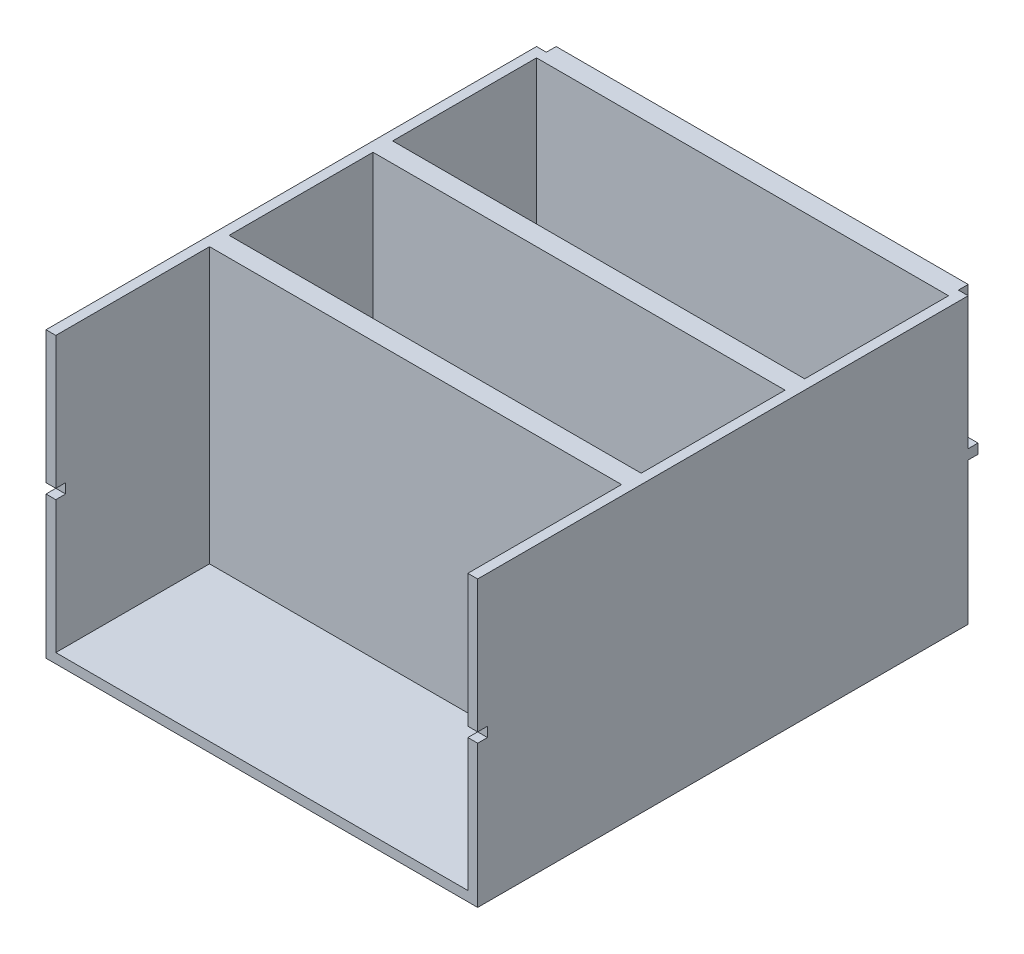
ISO-10303-21;
HEADER;
FILE_DESCRIPTION(('STEP AP214'),'2;1');
FILE_NAME('part.step','',(''),(''),'','','');
FILE_SCHEMA(('AUTOMOTIVE_DESIGN { 1 0 10303 214 1 1 1 1 }'));
ENDSEC;
DATA;
#1=APPLICATION_CONTEXT('core data for automotive mechanical design processes');
#2=APPLICATION_PROTOCOL_DEFINITION('international standard','automotive_design',2000,#1);
#3=PRODUCT_CONTEXT('',#1,'mechanical');
#4=PRODUCT('Part','Part','',(#3));
#5=PRODUCT_RELATED_PRODUCT_CATEGORY('part','',(#4));
#6=PRODUCT_DEFINITION_FORMATION('','',#4);
#7=PRODUCT_DEFINITION_CONTEXT('part definition',#1,'design');
#8=PRODUCT_DEFINITION('design','',#6,#7);
#9=PRODUCT_DEFINITION_SHAPE('','',#8);
#10=(LENGTH_UNIT() NAMED_UNIT(*) SI_UNIT(.MILLI.,.METRE.));
#11=(NAMED_UNIT(*) PLANE_ANGLE_UNIT() SI_UNIT($,.RADIAN.));
#12=(NAMED_UNIT(*) SI_UNIT($,.STERADIAN.) SOLID_ANGLE_UNIT());
#13=UNCERTAINTY_MEASURE_WITH_UNIT(LENGTH_MEASURE(1.E-05),#10,'distance_accuracy_value','');
#14=(GEOMETRIC_REPRESENTATION_CONTEXT(3) GLOBAL_UNCERTAINTY_ASSIGNED_CONTEXT((#13)) GLOBAL_UNIT_ASSIGNED_CONTEXT((#10,
#11,#12)) REPRESENTATION_CONTEXT('',''));
#15=CARTESIAN_POINT('',(0.,0.,0.));
#16=DIRECTION('',(0.,0.,1.));
#17=DIRECTION('',(1.,0.,0.));
#18=AXIS2_PLACEMENT_3D('',#15,#16,#17);
#19=CARTESIAN_POINT('',(-110.,5.,-125.));
#20=DIRECTION('',(0.,0.,1.));
#21=DIRECTION('',(1.,0.,0.));
#22=AXIS2_PLACEMENT_3D('',#19,#20,#21);
#23=PLANE('',#22);
#24=DIRECTION('',(1.,0.,0.));
#25=VECTOR('',#24,1.);
#26=CARTESIAN_POINT('',(-110.,77.5,-125.));
#27=LINE('',#26,#25);
#28=CARTESIAN_POINT('',(105.,77.5,-125.));
#29=VERTEX_POINT('',#28);
#30=CARTESIAN_POINT('',(110.,77.5,-125.));
#31=VERTEX_POINT('',#30);
#32=EDGE_CURVE('E56',#29,#31,#27,.T.);
#33=ORIENTED_EDGE('',*,*,#32,.F.);
#34=DIRECTION('',(0.,1.,0.));
#35=VECTOR('',#34,1.);
#36=CARTESIAN_POINT('',(105.,5.,-125.));
#37=LINE('',#36,#35);
#38=CARTESIAN_POINT('',(105.,145.,-125.));
#39=VERTEX_POINT('',#38);
#40=EDGE_CURVE('E296',#29,#39,#37,.T.);
#41=ORIENTED_EDGE('',*,*,#40,.T.);
#42=DIRECTION('',(-1.,0.,0.));
#43=VECTOR('',#42,1.);
#44=CARTESIAN_POINT('',(0.,145.,-125.));
#45=LINE('',#44,#43);
#46=CARTESIAN_POINT('',(110.,145.,-125.));
#47=VERTEX_POINT('',#46);
#48=EDGE_CURVE('E430',#47,#39,#45,.T.);
#49=ORIENTED_EDGE('',*,*,#48,.F.);
#50=DIRECTION('',(0.,-1.,0.));
#51=VECTOR('',#50,1.);
#52=CARTESIAN_POINT('',(110.,5.,-125.));
#53=LINE('',#52,#51);
#54=EDGE_CURVE('E11',#47,#31,#53,.T.);
#55=ORIENTED_EDGE('',*,*,#54,.T.);
#56=EDGE_LOOP('',(#33,#41,#49,#55));
#57=FACE_BOUND('',#56,.T.);
#58=ADVANCED_FACE('F41',(#57),#23,.F.);
#59=CARTESIAN_POINT('',(-105.,145.,-125.));
#60=VERTEX_POINT('',#59);
#61=CARTESIAN_POINT('',(-110.,145.,-125.));
#62=VERTEX_POINT('',#61);
#63=EDGE_CURVE('E429',#60,#62,#45,.T.);
#64=ORIENTED_EDGE('',*,*,#63,.F.);
#65=DIRECTION('',(0.,-1.,0.));
#66=VECTOR('',#65,1.);
#67=CARTESIAN_POINT('',(-105.,5.,-125.));
#68=LINE('',#67,#66);
#69=CARTESIAN_POINT('',(-105.,77.5,-125.));
#70=VERTEX_POINT('',#69);
#71=EDGE_CURVE('E64',#60,#70,#68,.T.);
#72=ORIENTED_EDGE('',*,*,#71,.T.);
#73=DIRECTION('',(-1.,0.,0.));
#74=VECTOR('',#73,1.);
#75=CARTESIAN_POINT('',(-110.,77.5,-125.));
#76=LINE('',#75,#74);
#77=CARTESIAN_POINT('',(-110.,77.5,-125.));
#78=VERTEX_POINT('',#77);
#79=EDGE_CURVE('E688',#70,#78,#76,.T.);
#80=ORIENTED_EDGE('',*,*,#79,.T.);
#81=DIRECTION('',(0.,-1.,0.));
#82=VECTOR('',#81,1.);
#83=CARTESIAN_POINT('',(-110.,5.,-125.));
#84=LINE('',#83,#82);
#85=EDGE_CURVE('E549',#62,#78,#84,.T.);
#86=ORIENTED_EDGE('',*,*,#85,.F.);
#87=EDGE_LOOP('',(#64,#72,#80,#86));
#88=FACE_BOUND('',#87,.T.);
#89=ADVANCED_FACE('F732',(#88),#23,.F.);
#90=CARTESIAN_POINT('',(-110.,5.,125.));
#91=DIRECTION('',(0.,0.,-1.));
#92=DIRECTION('',(-1.,0.,0.));
#93=AXIS2_PLACEMENT_3D('',#90,#91,#92);
#94=PLANE('',#93);
#95=DIRECTION('',(1.,0.,0.));
#96=VECTOR('',#95,1.);
#97=CARTESIAN_POINT('',(0.,77.5,125.));
#98=LINE('',#97,#96);
#99=CARTESIAN_POINT('',(105.,77.5,125.));
#100=VERTEX_POINT('',#99);
#101=CARTESIAN_POINT('',(110.,77.5,125.));
#102=VERTEX_POINT('',#101);
#103=EDGE_CURVE('E325',#100,#102,#98,.T.);
#104=ORIENTED_EDGE('',*,*,#103,.T.);
#105=DIRECTION('',(0.,-1.,0.));
#106=VECTOR('',#105,1.);
#107=CARTESIAN_POINT('',(110.,5.,125.));
#108=LINE('',#107,#106);
#109=CARTESIAN_POINT('',(110.,145.,125.));
#110=VERTEX_POINT('',#109);
#111=EDGE_CURVE('E540',#110,#102,#108,.T.);
#112=ORIENTED_EDGE('',*,*,#111,.F.);
#113=DIRECTION('',(1.,0.,0.));
#114=VECTOR('',#113,1.);
#115=CARTESIAN_POINT('',(0.,145.,125.));
#116=LINE('',#115,#114);
#117=CARTESIAN_POINT('',(105.,145.,125.));
#118=VERTEX_POINT('',#117);
#119=EDGE_CURVE('E420',#118,#110,#116,.T.);
#120=ORIENTED_EDGE('',*,*,#119,.F.);
#121=DIRECTION('',(0.,1.,0.));
#122=VECTOR('',#121,1.);
#123=CARTESIAN_POINT('',(105.,0.,125.));
#124=LINE('',#123,#122);
#125=EDGE_CURVE('E324',#100,#118,#124,.T.);
#126=ORIENTED_EDGE('',*,*,#125,.F.);
#127=EDGE_LOOP('',(#104,#112,#120,#126));
#128=FACE_BOUND('',#127,.T.);
#129=ADVANCED_FACE('F596',(#128),#94,.F.);
#130=DIRECTION('',(-1.,0.,0.));
#131=VECTOR('',#130,1.);
#132=CARTESIAN_POINT('',(0.,77.5,125.));
#133=LINE('',#132,#131);
#134=CARTESIAN_POINT('',(-105.,77.5,125.));
#135=VERTEX_POINT('',#134);
#136=CARTESIAN_POINT('',(-110.,77.5,125.));
#137=VERTEX_POINT('',#136);
#138=EDGE_CURVE('E316',#135,#137,#133,.T.);
#139=ORIENTED_EDGE('',*,*,#138,.F.);
#140=DIRECTION('',(0.,-1.,0.));
#141=VECTOR('',#140,1.);
#142=CARTESIAN_POINT('',(-105.,0.,125.));
#143=LINE('',#142,#141);
#144=CARTESIAN_POINT('',(-105.,145.,125.));
#145=VERTEX_POINT('',#144);
#146=EDGE_CURVE('E320',#145,#135,#143,.T.);
#147=ORIENTED_EDGE('',*,*,#146,.F.);
#148=CARTESIAN_POINT('',(-110.,145.,125.));
#149=VERTEX_POINT('',#148);
#150=EDGE_CURVE('E421',#149,#145,#116,.T.);
#151=ORIENTED_EDGE('',*,*,#150,.F.);
#152=DIRECTION('',(0.,-1.,0.));
#153=VECTOR('',#152,1.);
#154=CARTESIAN_POINT('',(-110.,5.,125.));
#155=LINE('',#154,#153);
#156=EDGE_CURVE('E545',#149,#137,#155,.T.);
#157=ORIENTED_EDGE('',*,*,#156,.T.);
#158=EDGE_LOOP('',(#139,#147,#151,#157));
#159=FACE_BOUND('',#158,.T.);
#160=ADVANCED_FACE('F737',(#159),#94,.F.);
#161=CARTESIAN_POINT('',(110.,5.,125.));
#162=DIRECTION('',(-1.,0.,0.));
#163=DIRECTION('',(0.,0.,1.));
#164=AXIS2_PLACEMENT_3D('',#161,#162,#163);
#165=PLANE('',#164);
#166=DIRECTION('',(0.,1.,0.));
#167=VECTOR('',#166,1.);
#168=CARTESIAN_POINT('',(110.,0.,120.));
#169=LINE('',#168,#167);
#170=CARTESIAN_POINT('',(110.,72.5,120.));
#171=VERTEX_POINT('',#170);
#172=CARTESIAN_POINT('',(110.,77.5,120.));
#173=VERTEX_POINT('',#172);
#174=EDGE_CURVE('E354',#171,#173,#169,.T.);
#175=ORIENTED_EDGE('',*,*,#174,.F.);
#176=DIRECTION('',(0.,0.,1.));
#177=VECTOR('',#176,1.);
#178=CARTESIAN_POINT('',(110.,72.5,-140.768096208106));
#179=LINE('',#178,#177);
#180=CARTESIAN_POINT('',(110.,72.5,125.));
#181=VERTEX_POINT('',#180);
#182=EDGE_CURVE('E359',#171,#181,#179,.T.);
#183=ORIENTED_EDGE('',*,*,#182,.T.);
#184=CARTESIAN_POINT('',(110.,0.,125.));
#185=VERTEX_POINT('',#184);
#186=EDGE_CURVE('E539',#181,#185,#108,.T.);
#187=ORIENTED_EDGE('',*,*,#186,.T.);
#188=DIRECTION('',(0.,0.,-1.));
#189=VECTOR('',#188,1.);
#190=CARTESIAN_POINT('',(110.,0.,125.));
#191=LINE('',#190,#189);
#192=CARTESIAN_POINT('',(110.,0.,-125.));
#193=VERTEX_POINT('',#192);
#194=EDGE_CURVE('E496',#185,#193,#191,.T.);
#195=ORIENTED_EDGE('',*,*,#194,.T.);
#196=CARTESIAN_POINT('',(110.,72.5,-125.));
#197=VERTEX_POINT('',#196);
#198=EDGE_CURVE('E50',#197,#193,#53,.T.);
#199=ORIENTED_EDGE('',*,*,#198,.F.);
#200=DIRECTION('',(0.,0.,1.));
#201=VECTOR('',#200,1.);
#202=CARTESIAN_POINT('',(110.,72.5,-130.));
#203=LINE('',#202,#201);
#204=CARTESIAN_POINT('',(110.,72.5,-130.));
#205=VERTEX_POINT('',#204);
#206=EDGE_CURVE('E281',#205,#197,#203,.T.);
#207=ORIENTED_EDGE('',*,*,#206,.F.);
#208=DIRECTION('',(0.,-1.,0.));
#209=VECTOR('',#208,1.);
#210=CARTESIAN_POINT('',(110.,5.,-130.));
#211=LINE('',#210,#209);
#212=CARTESIAN_POINT('',(110.,77.5,-130.));
#213=VERTEX_POINT('',#212);
#214=EDGE_CURVE('E274',#213,#205,#211,.T.);
#215=ORIENTED_EDGE('',*,*,#214,.F.);
#216=DIRECTION('',(0.,0.,1.));
#217=VECTOR('',#216,1.);
#218=CARTESIAN_POINT('',(110.,77.5,-130.));
#219=LINE('',#218,#217);
#220=EDGE_CURVE('E278',#213,#31,#219,.T.);
#221=ORIENTED_EDGE('',*,*,#220,.T.);
#222=ORIENTED_EDGE('',*,*,#54,.F.);
#223=DIRECTION('',(0.,0.,-1.));
#224=VECTOR('',#223,1.);
#225=CARTESIAN_POINT('',(110.,145.,0.));
#226=LINE('',#225,#224);
#227=EDGE_CURVE('E425',#110,#47,#226,.T.);
#228=ORIENTED_EDGE('',*,*,#227,.F.);
#229=ORIENTED_EDGE('',*,*,#111,.T.);
#230=DIRECTION('',(0.,0.,1.));
#231=VECTOR('',#230,1.);
#232=CARTESIAN_POINT('',(110.,77.5,-140.768096208106));
#233=LINE('',#232,#231);
#234=EDGE_CURVE('E358',#173,#102,#233,.T.);
#235=ORIENTED_EDGE('',*,*,#234,.F.);
#236=EDGE_LOOP('',(#175,#183,#187,#195,#199,#207,#215,#221,#222,#228,#229,#235));
#237=FACE_BOUND('',#236,.T.);
#238=ADVANCED_FACE('F43',(#237),#165,.F.);
#239=CARTESIAN_POINT('',(-110.,72.5,-125.));
#240=VERTEX_POINT('',#239);
#241=CARTESIAN_POINT('',(-110.,0.,-125.));
#242=VERTEX_POINT('',#241);
#243=EDGE_CURVE('E548',#240,#242,#84,.T.);
#244=ORIENTED_EDGE('',*,*,#243,.F.);
#245=DIRECTION('',(1.,0.,0.));
#246=VECTOR('',#245,1.);
#247=CARTESIAN_POINT('',(-110.,72.5,-125.));
#248=LINE('',#247,#246);
#249=CARTESIAN_POINT('',(-105.,72.5,-125.));
#250=VERTEX_POINT('',#249);
#251=EDGE_CURVE('E685',#240,#250,#248,.T.);
#252=ORIENTED_EDGE('',*,*,#251,.T.);
#253=DIRECTION('',(0.,-1.,0.));
#254=VECTOR('',#253,1.);
#255=CARTESIAN_POINT('',(-105.,5.,-125.));
#256=LINE('',#255,#254);
#257=CARTESIAN_POINT('',(-105.,5.,-125.));
#258=VERTEX_POINT('',#257);
#259=EDGE_CURVE('E682',#250,#258,#256,.T.);
#260=ORIENTED_EDGE('',*,*,#259,.T.);
#261=DIRECTION('',(1.,0.,0.));
#262=VECTOR('',#261,1.);
#263=CARTESIAN_POINT('',(-110.,5.,-125.));
#264=LINE('',#263,#262);
#265=CARTESIAN_POINT('',(105.,5.,-125.));
#266=VERTEX_POINT('',#265);
#267=EDGE_CURVE('E675',#258,#266,#264,.T.);
#268=ORIENTED_EDGE('',*,*,#267,.T.);
#269=DIRECTION('',(0.,1.,0.));
#270=VECTOR('',#269,1.);
#271=CARTESIAN_POINT('',(105.,5.,-125.));
#272=LINE('',#271,#270);
#273=CARTESIAN_POINT('',(105.,72.5,-125.));
#274=VERTEX_POINT('',#273);
#275=EDGE_CURVE('E665',#266,#274,#272,.T.);
#276=ORIENTED_EDGE('',*,*,#275,.T.);
#277=DIRECTION('',(-1.,0.,0.));
#278=VECTOR('',#277,1.);
#279=CARTESIAN_POINT('',(-110.,72.5,-125.));
#280=LINE('',#279,#278);
#281=EDGE_CURVE('E669',#197,#274,#280,.T.);
#282=ORIENTED_EDGE('',*,*,#281,.F.);
#283=ORIENTED_EDGE('',*,*,#198,.T.);
#284=DIRECTION('',(-1.,0.,0.));
#285=VECTOR('',#284,1.);
#286=CARTESIAN_POINT('',(-110.,0.,-125.));
#287=LINE('',#286,#285);
#288=EDGE_CURVE('E527',#193,#242,#287,.T.);
#289=ORIENTED_EDGE('',*,*,#288,.T.);
#290=EDGE_LOOP('',(#244,#252,#260,#268,#276,#282,#283,#289));
#291=FACE_BOUND('',#290,.T.);
#292=ADVANCED_FACE('F569',(#291),#23,.F.);
#293=CARTESIAN_POINT('',(-110.,5.,125.));
#294=DIRECTION('',(1.,0.,0.));
#295=DIRECTION('',(0.,0.,-1.));
#296=AXIS2_PLACEMENT_3D('',#293,#294,#295);
#297=PLANE('',#296);
#298=DIRECTION('',(0.,-1.,0.));
#299=VECTOR('',#298,1.);
#300=CARTESIAN_POINT('',(-110.,0.,120.));
#301=LINE('',#300,#299);
#302=CARTESIAN_POINT('',(-110.,77.5,120.));
#303=VERTEX_POINT('',#302);
#304=CARTESIAN_POINT('',(-110.,72.5,120.));
#305=VERTEX_POINT('',#304);
#306=EDGE_CURVE('E342',#303,#305,#301,.T.);
#307=ORIENTED_EDGE('',*,*,#306,.F.);
#308=DIRECTION('',(0.,0.,1.));
#309=VECTOR('',#308,1.);
#310=CARTESIAN_POINT('',(-110.,77.5,-140.768096208106));
#311=LINE('',#310,#309);
#312=EDGE_CURVE('E347',#303,#137,#311,.T.);
#313=ORIENTED_EDGE('',*,*,#312,.T.);
#314=ORIENTED_EDGE('',*,*,#156,.F.);
#315=DIRECTION('',(0.,0.,1.));
#316=VECTOR('',#315,1.);
#317=CARTESIAN_POINT('',(-110.,145.,0.));
#318=LINE('',#317,#316);
#319=EDGE_CURVE('E434',#62,#149,#318,.T.);
#320=ORIENTED_EDGE('',*,*,#319,.F.);
#321=ORIENTED_EDGE('',*,*,#85,.T.);
#322=DIRECTION('',(0.,0.,1.));
#323=VECTOR('',#322,1.);
#324=CARTESIAN_POINT('',(-110.,77.5,-130.));
#325=LINE('',#324,#323);
#326=CARTESIAN_POINT('',(-110.,77.5,-130.));
#327=VERTEX_POINT('',#326);
#328=EDGE_CURVE('E641',#327,#78,#325,.T.);
#329=ORIENTED_EDGE('',*,*,#328,.F.);
#330=DIRECTION('',(0.,-1.,0.));
#331=VECTOR('',#330,1.);
#332=CARTESIAN_POINT('',(-110.,5.,-130.));
#333=LINE('',#332,#331);
#334=CARTESIAN_POINT('',(-110.,72.5,-130.));
#335=VERTEX_POINT('',#334);
#336=EDGE_CURVE('E709',#327,#335,#333,.T.);
#337=ORIENTED_EDGE('',*,*,#336,.T.);
#338=DIRECTION('',(0.,0.,1.));
#339=VECTOR('',#338,1.);
#340=CARTESIAN_POINT('',(-110.,72.5,-130.));
#341=LINE('',#340,#339);
#342=EDGE_CURVE('E565',#335,#240,#341,.T.);
#343=ORIENTED_EDGE('',*,*,#342,.T.);
#344=ORIENTED_EDGE('',*,*,#243,.T.);
#345=DIRECTION('',(0.,0.,1.));
#346=VECTOR('',#345,1.);
#347=CARTESIAN_POINT('',(-110.,0.,125.));
#348=LINE('',#347,#346);
#349=CARTESIAN_POINT('',(-110.,0.,125.));
#350=VERTEX_POINT('',#349);
#351=EDGE_CURVE('E531',#242,#350,#348,.T.);
#352=ORIENTED_EDGE('',*,*,#351,.T.);
#353=CARTESIAN_POINT('',(-110.,72.5,125.));
#354=VERTEX_POINT('',#353);
#355=EDGE_CURVE('E544',#354,#350,#155,.T.);
#356=ORIENTED_EDGE('',*,*,#355,.F.);
#357=DIRECTION('',(0.,0.,1.));
#358=VECTOR('',#357,1.);
#359=CARTESIAN_POINT('',(-110.,72.5,-140.768096208106));
#360=LINE('',#359,#358);
#361=EDGE_CURVE('E346',#305,#354,#360,.T.);
#362=ORIENTED_EDGE('',*,*,#361,.F.);
#363=EDGE_LOOP('',(#307,#313,#314,#320,#321,#329,#337,#343,#344,#352,#356,#362));
#364=FACE_BOUND('',#363,.T.);
#365=ADVANCED_FACE('F560',(#364),#297,.F.);
#366=ORIENTED_EDGE('',*,*,#186,.F.);
#367=DIRECTION('',(1.,0.,0.));
#368=VECTOR('',#367,1.);
#369=CARTESIAN_POINT('',(0.,72.5,125.));
#370=LINE('',#369,#368);
#371=CARTESIAN_POINT('',(105.,72.5,125.));
#372=VERTEX_POINT('',#371);
#373=EDGE_CURVE('E331',#372,#181,#370,.T.);
#374=ORIENTED_EDGE('',*,*,#373,.F.);
#375=CARTESIAN_POINT('',(105.,5.,125.));
#376=VERTEX_POINT('',#375);
#377=EDGE_CURVE('E334',#376,#372,#124,.T.);
#378=ORIENTED_EDGE('',*,*,#377,.F.);
#379=DIRECTION('',(1.,0.,0.));
#380=VECTOR('',#379,1.);
#381=CARTESIAN_POINT('',(0.,5.,125.));
#382=LINE('',#381,#380);
#383=CARTESIAN_POINT('',(-105.,5.,125.));
#384=VERTEX_POINT('',#383);
#385=EDGE_CURVE('E338',#384,#376,#382,.T.);
#386=ORIENTED_EDGE('',*,*,#385,.F.);
#387=CARTESIAN_POINT('',(-105.,72.5,125.));
#388=VERTEX_POINT('',#387);
#389=EDGE_CURVE('E319',#388,#384,#143,.T.);
#390=ORIENTED_EDGE('',*,*,#389,.F.);
#391=DIRECTION('',(-1.,0.,0.));
#392=VECTOR('',#391,1.);
#393=CARTESIAN_POINT('',(0.,72.5,125.));
#394=LINE('',#393,#392);
#395=EDGE_CURVE('E310',#388,#354,#394,.T.);
#396=ORIENTED_EDGE('',*,*,#395,.T.);
#397=ORIENTED_EDGE('',*,*,#355,.T.);
#398=DIRECTION('',(1.,0.,0.));
#399=VECTOR('',#398,1.);
#400=CARTESIAN_POINT('',(-110.,0.,125.));
#401=LINE('',#400,#399);
#402=EDGE_CURVE('E535',#350,#185,#401,.T.);
#403=ORIENTED_EDGE('',*,*,#402,.T.);
#404=EDGE_LOOP('',(#366,#374,#378,#386,#390,#396,#397,#403));
#405=FACE_BOUND('',#404,.T.);
#406=ADVANCED_FACE('F575',(#405),#94,.F.);
#407=CARTESIAN_POINT('',(0.,0.,0.));
#408=DIRECTION('',(0.,-1.,0.));
#409=DIRECTION('',(0.,0.,-1.));
#410=AXIS2_PLACEMENT_3D('',#407,#408,#409);
#411=PLANE('',#410);
#412=ORIENTED_EDGE('',*,*,#194,.F.);
#413=ORIENTED_EDGE('',*,*,#402,.F.);
#414=ORIENTED_EDGE('',*,*,#351,.F.);
#415=ORIENTED_EDGE('',*,*,#288,.F.);
#416=EDGE_LOOP('',(#412,#413,#414,#415));
#417=FACE_BOUND('',#416,.T.);
#418=ADVANCED_FACE('F572',(#417),#411,.T.);
#419=CARTESIAN_POINT('',(-105.,145.,0.));
#420=DIRECTION('',(-1.,0.,0.));
#421=DIRECTION('',(0.,0.,1.));
#422=AXIS2_PLACEMENT_3D('',#419,#420,#421);
#423=PLANE('',#422);
#424=DIRECTION('',(0.,0.,-1.));
#425=VECTOR('',#424,1.);
#426=CARTESIAN_POINT('',(-105.,5.,0.));
#427=LINE('',#426,#425);
#428=CARTESIAN_POINT('',(-105.,5.,46.6666666666667));
#429=VERTEX_POINT('',#428);
#430=EDGE_CURVE('E478',#384,#429,#427,.T.);
#431=ORIENTED_EDGE('',*,*,#430,.T.);
#432=DIRECTION('',(0.,-1.,0.));
#433=VECTOR('',#432,1.);
#434=CARTESIAN_POINT('',(-105.,145.,46.6666666666667));
#435=LINE('',#434,#433);
#436=CARTESIAN_POINT('',(-105.,145.,46.6666666666667));
#437=VERTEX_POINT('',#436);
#438=EDGE_CURVE('E492',#437,#429,#435,.T.);
#439=ORIENTED_EDGE('',*,*,#438,.F.);
#440=DIRECTION('',(0.,0.,-1.));
#441=VECTOR('',#440,1.);
#442=CARTESIAN_POINT('',(-105.,145.,0.));
#443=LINE('',#442,#441);
#444=EDGE_CURVE('E438',#145,#437,#443,.T.);
#445=ORIENTED_EDGE('',*,*,#444,.F.);
#446=ORIENTED_EDGE('',*,*,#146,.T.);
#447=DIRECTION('',(0.,0.,1.));
#448=VECTOR('',#447,1.);
#449=CARTESIAN_POINT('',(-105.,77.5,-140.768096208106));
#450=LINE('',#449,#448);
#451=CARTESIAN_POINT('',(-105.,77.5,120.));
#452=VERTEX_POINT('',#451);
#453=EDGE_CURVE('E329',#452,#135,#450,.T.);
#454=ORIENTED_EDGE('',*,*,#453,.F.);
#455=DIRECTION('',(0.,-1.,0.));
#456=VECTOR('',#455,1.);
#457=CARTESIAN_POINT('',(-105.,145.,120.));
#458=LINE('',#457,#456);
#459=CARTESIAN_POINT('',(-105.,72.5,120.));
#460=VERTEX_POINT('',#459);
#461=EDGE_CURVE('E385',#452,#460,#458,.T.);
#462=ORIENTED_EDGE('',*,*,#461,.T.);
#463=DIRECTION('',(0.,0.,1.));
#464=VECTOR('',#463,1.);
#465=CARTESIAN_POINT('',(-105.,72.5,-140.768096208106));
#466=LINE('',#465,#464);
#467=EDGE_CURVE('E315',#460,#388,#466,.T.);
#468=ORIENTED_EDGE('',*,*,#467,.T.);
#469=ORIENTED_EDGE('',*,*,#389,.T.);
#470=EDGE_LOOP('',(#431,#439,#445,#446,#454,#462,#468,#469));
#471=FACE_BOUND('',#470,.T.);
#472=ADVANCED_FACE('F740',(#471),#423,.F.);
#473=CARTESIAN_POINT('',(0.,145.,46.6666666666667));
#474=DIRECTION('',(0.,0.,-1.));
#475=DIRECTION('',(-1.,0.,0.));
#476=AXIS2_PLACEMENT_3D('',#473,#474,#475);
#477=PLANE('',#476);
#478=DIRECTION('',(1.,0.,0.));
#479=VECTOR('',#478,1.);
#480=CARTESIAN_POINT('',(0.,5.,46.6666666666667));
#481=LINE('',#480,#479);
#482=CARTESIAN_POINT('',(105.,5.,46.6666666666667));
#483=VERTEX_POINT('',#482);
#484=EDGE_CURVE('E482',#429,#483,#481,.T.);
#485=ORIENTED_EDGE('',*,*,#484,.T.);
#486=DIRECTION('',(0.,-1.,0.));
#487=VECTOR('',#486,1.);
#488=CARTESIAN_POINT('',(105.,145.,46.6666666666667));
#489=LINE('',#488,#487);
#490=CARTESIAN_POINT('',(105.,145.,46.6666666666667));
#491=VERTEX_POINT('',#490);
#492=EDGE_CURVE('E489',#491,#483,#489,.T.);
#493=ORIENTED_EDGE('',*,*,#492,.F.);
#494=DIRECTION('',(1.,0.,0.));
#495=VECTOR('',#494,1.);
#496=CARTESIAN_POINT('',(0.,145.,46.6666666666667));
#497=LINE('',#496,#495);
#498=EDGE_CURVE('E442',#437,#491,#497,.T.);
#499=ORIENTED_EDGE('',*,*,#498,.F.);
#500=ORIENTED_EDGE('',*,*,#438,.T.);
#501=EDGE_LOOP('',(#485,#493,#499,#500));
#502=FACE_BOUND('',#501,.T.);
#503=ADVANCED_FACE('F605',(#502),#477,.F.);
#504=CARTESIAN_POINT('',(105.,145.,0.));
#505=DIRECTION('',(-1.,0.,0.));
#506=DIRECTION('',(0.,0.,1.));
#507=AXIS2_PLACEMENT_3D('',#504,#505,#506);
#508=PLANE('',#507);
#509=DIRECTION('',(0.,0.,-1.));
#510=VECTOR('',#509,1.);
#511=CARTESIAN_POINT('',(105.,5.,0.));
#512=LINE('',#511,#510);
#513=EDGE_CURVE('E395',#376,#483,#512,.T.);
#514=ORIENTED_EDGE('',*,*,#513,.F.);
#515=ORIENTED_EDGE('',*,*,#377,.T.);
#516=DIRECTION('',(0.,0.,1.));
#517=VECTOR('',#516,1.);
#518=CARTESIAN_POINT('',(105.,72.5,-140.768096208106));
#519=LINE('',#518,#517);
#520=CARTESIAN_POINT('',(105.,72.5,120.));
#521=VERTEX_POINT('',#520);
#522=EDGE_CURVE('E364',#521,#372,#519,.T.);
#523=ORIENTED_EDGE('',*,*,#522,.F.);
#524=DIRECTION('',(0.,-1.,0.));
#525=VECTOR('',#524,1.);
#526=CARTESIAN_POINT('',(105.,145.,120.));
#527=LINE('',#526,#525);
#528=CARTESIAN_POINT('',(105.,77.5,120.));
#529=VERTEX_POINT('',#528);
#530=EDGE_CURVE('E314',#529,#521,#527,.T.);
#531=ORIENTED_EDGE('',*,*,#530,.F.);
#532=DIRECTION('',(0.,0.,1.));
#533=VECTOR('',#532,1.);
#534=CARTESIAN_POINT('',(105.,77.5,-140.768096208106));
#535=LINE('',#534,#533);
#536=EDGE_CURVE('E330',#529,#100,#535,.T.);
#537=ORIENTED_EDGE('',*,*,#536,.T.);
#538=ORIENTED_EDGE('',*,*,#125,.T.);
#539=DIRECTION('',(0.,0.,-1.));
#540=VECTOR('',#539,1.);
#541=CARTESIAN_POINT('',(105.,145.,0.));
#542=LINE('',#541,#540);
#543=EDGE_CURVE('E445',#118,#491,#542,.T.);
#544=ORIENTED_EDGE('',*,*,#543,.T.);
#545=ORIENTED_EDGE('',*,*,#492,.T.);
#546=EDGE_LOOP('',(#514,#515,#523,#531,#537,#538,#544,#545));
#547=FACE_BOUND('',#546,.T.);
#548=ADVANCED_FACE('F591',(#547),#508,.T.);
#549=CARTESIAN_POINT('',(105.,145.,0.));
#550=DIRECTION('',(-1.,0.,0.));
#551=DIRECTION('',(0.,0.,1.));
#552=AXIS2_PLACEMENT_3D('',#549,#550,#551);
#553=PLANE('',#552);
#554=DIRECTION('',(0.,0.,-1.));
#555=VECTOR('',#554,1.);
#556=CARTESIAN_POINT('',(105.,5.,0.));
#557=LINE('',#556,#555);
#558=CARTESIAN_POINT('',(105.,5.,36.6666666666667));
#559=VERTEX_POINT('',#558);
#560=CARTESIAN_POINT('',(105.,5.,-36.6666666666667));
#561=VERTEX_POINT('',#560);
#562=EDGE_CURVE('E463',#559,#561,#557,.T.);
#563=ORIENTED_EDGE('',*,*,#562,.F.);
#564=DIRECTION('',(0.,-1.,0.));
#565=VECTOR('',#564,1.);
#566=CARTESIAN_POINT('',(105.,145.,36.6666666666667));
#567=LINE('',#566,#565);
#568=CARTESIAN_POINT('',(105.,145.,36.6666666666667));
#569=VERTEX_POINT('',#568);
#570=EDGE_CURVE('E493',#569,#559,#567,.T.);
#571=ORIENTED_EDGE('',*,*,#570,.F.);
#572=DIRECTION('',(0.,0.,-1.));
#573=VECTOR('',#572,1.);
#574=CARTESIAN_POINT('',(105.,145.,0.));
#575=LINE('',#574,#573);
#576=CARTESIAN_POINT('',(105.,145.,-36.6666666666667));
#577=VERTEX_POINT('',#576);
#578=EDGE_CURVE('E405',#569,#577,#575,.T.);
#579=ORIENTED_EDGE('',*,*,#578,.T.);
#580=DIRECTION('',(0.,-1.,0.));
#581=VECTOR('',#580,1.);
#582=CARTESIAN_POINT('',(105.,145.,-36.6666666666667));
#583=LINE('',#582,#581);
#584=EDGE_CURVE('E497',#577,#561,#583,.T.);
#585=ORIENTED_EDGE('',*,*,#584,.T.);
#586=EDGE_LOOP('',(#563,#571,#579,#585));
#587=FACE_BOUND('',#586,.T.);
#588=ADVANCED_FACE('F807',(#587),#553,.T.);
#589=CARTESIAN_POINT('',(0.,145.,36.6666666666667));
#590=DIRECTION('',(0.,0.,1.));
#591=DIRECTION('',(1.,0.,0.));
#592=AXIS2_PLACEMENT_3D('',#589,#590,#591);
#593=PLANE('',#592);
#594=DIRECTION('',(-1.,0.,0.));
#595=VECTOR('',#594,1.);
#596=CARTESIAN_POINT('',(0.,5.,36.6666666666667));
#597=LINE('',#596,#595);
#598=CARTESIAN_POINT('',(-105.,5.,36.6666666666667));
#599=VERTEX_POINT('',#598);
#600=EDGE_CURVE('E467',#559,#599,#597,.T.);
#601=ORIENTED_EDGE('',*,*,#600,.T.);
#602=DIRECTION('',(0.,-1.,0.));
#603=VECTOR('',#602,1.);
#604=CARTESIAN_POINT('',(-105.,145.,36.6666666666667));
#605=LINE('',#604,#603);
#606=CARTESIAN_POINT('',(-105.,145.,36.6666666666667));
#607=VERTEX_POINT('',#606);
#608=EDGE_CURVE('E505',#607,#599,#605,.T.);
#609=ORIENTED_EDGE('',*,*,#608,.F.);
#610=DIRECTION('',(-1.,0.,0.));
#611=VECTOR('',#610,1.);
#612=CARTESIAN_POINT('',(0.,145.,36.6666666666667));
#613=LINE('',#612,#611);
#614=EDGE_CURVE('E409',#569,#607,#613,.T.);
#615=ORIENTED_EDGE('',*,*,#614,.F.);
#616=ORIENTED_EDGE('',*,*,#570,.T.);
#617=EDGE_LOOP('',(#601,#609,#615,#616));
#618=FACE_BOUND('',#617,.T.);
#619=ADVANCED_FACE('F810',(#618),#593,.F.);
#620=CARTESIAN_POINT('',(-105.,145.,0.));
#621=DIRECTION('',(-1.,0.,0.));
#622=DIRECTION('',(0.,0.,1.));
#623=AXIS2_PLACEMENT_3D('',#620,#621,#622);
#624=PLANE('',#623);
#625=DIRECTION('',(0.,0.,-1.));
#626=VECTOR('',#625,1.);
#627=CARTESIAN_POINT('',(-105.,5.,0.));
#628=LINE('',#627,#626);
#629=CARTESIAN_POINT('',(-105.,5.,-36.6666666666667));
#630=VERTEX_POINT('',#629);
#631=EDGE_CURVE('E471',#599,#630,#628,.T.);
#632=ORIENTED_EDGE('',*,*,#631,.T.);
#633=DIRECTION('',(0.,-1.,0.));
#634=VECTOR('',#633,1.);
#635=CARTESIAN_POINT('',(-105.,145.,-36.6666666666667));
#636=LINE('',#635,#634);
#637=CARTESIAN_POINT('',(-105.,145.,-36.6666666666667));
#638=VERTEX_POINT('',#637);
#639=EDGE_CURVE('E500',#638,#630,#636,.T.);
#640=ORIENTED_EDGE('',*,*,#639,.F.);
#641=DIRECTION('',(0.,0.,-1.));
#642=VECTOR('',#641,1.);
#643=CARTESIAN_POINT('',(-105.,145.,0.));
#644=LINE('',#643,#642);
#645=EDGE_CURVE('E413',#607,#638,#644,.T.);
#646=ORIENTED_EDGE('',*,*,#645,.F.);
#647=ORIENTED_EDGE('',*,*,#608,.T.);
#648=EDGE_LOOP('',(#632,#640,#646,#647));
#649=FACE_BOUND('',#648,.T.);
#650=ADVANCED_FACE('F793',(#649),#624,.F.);
#651=CARTESIAN_POINT('',(105.,145.,0.));
#652=DIRECTION('',(-1.,0.,0.));
#653=DIRECTION('',(0.,0.,1.));
#654=AXIS2_PLACEMENT_3D('',#651,#652,#653);
#655=PLANE('',#654);
#656=DIRECTION('',(0.,0.,-1.));
#657=VECTOR('',#656,1.);
#658=CARTESIAN_POINT('',(105.,5.,0.));
#659=LINE('',#658,#657);
#660=CARTESIAN_POINT('',(105.,5.,-46.6666666666667));
#661=VERTEX_POINT('',#660);
#662=CARTESIAN_POINT('',(105.,5.,-120.));
#663=VERTEX_POINT('',#662);
#664=EDGE_CURVE('E389',#661,#663,#659,.T.);
#665=ORIENTED_EDGE('',*,*,#664,.F.);
#666=DIRECTION('',(0.,-1.,0.));
#667=VECTOR('',#666,1.);
#668=CARTESIAN_POINT('',(105.,145.,-46.6666666666667));
#669=LINE('',#668,#667);
#670=CARTESIAN_POINT('',(105.,145.,-46.6666666666667));
#671=VERTEX_POINT('',#670);
#672=EDGE_CURVE('E501',#671,#661,#669,.T.);
#673=ORIENTED_EDGE('',*,*,#672,.F.);
#674=DIRECTION('',(0.,0.,-1.));
#675=VECTOR('',#674,1.);
#676=CARTESIAN_POINT('',(105.,145.,0.));
#677=LINE('',#676,#675);
#678=CARTESIAN_POINT('',(105.,145.,-120.));
#679=VERTEX_POINT('',#678);
#680=EDGE_CURVE('E390',#671,#679,#677,.T.);
#681=ORIENTED_EDGE('',*,*,#680,.T.);
#682=DIRECTION('',(0.,-1.,0.));
#683=VECTOR('',#682,1.);
#684=CARTESIAN_POINT('',(105.,145.,-120.));
#685=LINE('',#684,#683);
#686=EDGE_CURVE('E449',#679,#663,#685,.T.);
#687=ORIENTED_EDGE('',*,*,#686,.T.);
#688=EDGE_LOOP('',(#665,#673,#681,#687));
#689=FACE_BOUND('',#688,.T.);
#690=ADVANCED_FACE('F789',(#689),#655,.T.);
#691=CARTESIAN_POINT('',(0.,145.,-46.6666666666667));
#692=DIRECTION('',(0.,0.,-1.));
#693=DIRECTION('',(-1.,0.,0.));
#694=AXIS2_PLACEMENT_3D('',#691,#692,#693);
#695=PLANE('',#694);
#696=DIRECTION('',(1.,0.,0.));
#697=VECTOR('',#696,1.);
#698=CARTESIAN_POINT('',(0.,5.,-46.6666666666667));
#699=LINE('',#698,#697);
#700=CARTESIAN_POINT('',(-105.,5.,-46.6666666666667));
#701=VERTEX_POINT('',#700);
#702=EDGE_CURVE('E452',#701,#661,#699,.T.);
#703=ORIENTED_EDGE('',*,*,#702,.F.);
#704=DIRECTION('',(0.,-1.,0.));
#705=VECTOR('',#704,1.);
#706=CARTESIAN_POINT('',(-105.,145.,-46.6666666666667));
#707=LINE('',#706,#705);
#708=CARTESIAN_POINT('',(-105.,145.,-46.6666666666667));
#709=VERTEX_POINT('',#708);
#710=EDGE_CURVE('E517',#709,#701,#707,.T.);
#711=ORIENTED_EDGE('',*,*,#710,.F.);
#712=DIRECTION('',(1.,0.,0.));
#713=VECTOR('',#712,1.);
#714=CARTESIAN_POINT('',(0.,145.,-46.6666666666667));
#715=LINE('',#714,#713);
#716=EDGE_CURVE('E394',#709,#671,#715,.T.);
#717=ORIENTED_EDGE('',*,*,#716,.T.);
#718=ORIENTED_EDGE('',*,*,#672,.T.);
#719=EDGE_LOOP('',(#703,#711,#717,#718));
#720=FACE_BOUND('',#719,.T.);
#721=ADVANCED_FACE('F792',(#720),#695,.T.);
#722=CARTESIAN_POINT('',(-105.,145.,0.));
#723=DIRECTION('',(-1.,0.,0.));
#724=DIRECTION('',(0.,0.,1.));
#725=AXIS2_PLACEMENT_3D('',#722,#723,#724);
#726=PLANE('',#725);
#727=DIRECTION('',(0.,0.,-1.));
#728=VECTOR('',#727,1.);
#729=CARTESIAN_POINT('',(-105.,5.,0.));
#730=LINE('',#729,#728);
#731=CARTESIAN_POINT('',(-105.,5.,-120.));
#732=VERTEX_POINT('',#731);
#733=EDGE_CURVE('E455',#701,#732,#730,.T.);
#734=ORIENTED_EDGE('',*,*,#733,.T.);
#735=DIRECTION('',(0.,-1.,0.));
#736=VECTOR('',#735,1.);
#737=CARTESIAN_POINT('',(-105.,145.,-120.));
#738=LINE('',#737,#736);
#739=CARTESIAN_POINT('',(-105.,145.,-120.));
#740=VERTEX_POINT('',#739);
#741=EDGE_CURVE('E513',#740,#732,#738,.T.);
#742=ORIENTED_EDGE('',*,*,#741,.F.);
#743=DIRECTION('',(0.,0.,-1.));
#744=VECTOR('',#743,1.);
#745=CARTESIAN_POINT('',(-105.,145.,0.));
#746=LINE('',#745,#744);
#747=EDGE_CURVE('E399',#709,#740,#746,.T.);
#748=ORIENTED_EDGE('',*,*,#747,.F.);
#749=ORIENTED_EDGE('',*,*,#710,.T.);
#750=EDGE_LOOP('',(#734,#742,#748,#749));
#751=FACE_BOUND('',#750,.T.);
#752=ADVANCED_FACE('F797',(#751),#726,.F.);
#753=CARTESIAN_POINT('',(0.,145.,-36.6666666666667));
#754=DIRECTION('',(0.,0.,1.));
#755=DIRECTION('',(1.,0.,0.));
#756=AXIS2_PLACEMENT_3D('',#753,#754,#755);
#757=PLANE('',#756);
#758=DIRECTION('',(-1.,0.,0.));
#759=VECTOR('',#758,1.);
#760=CARTESIAN_POINT('',(0.,5.,-36.6666666666667));
#761=LINE('',#760,#759);
#762=EDGE_CURVE('E474',#561,#630,#761,.T.);
#763=ORIENTED_EDGE('',*,*,#762,.F.);
#764=ORIENTED_EDGE('',*,*,#584,.F.);
#765=DIRECTION('',(-1.,0.,0.));
#766=VECTOR('',#765,1.);
#767=CARTESIAN_POINT('',(0.,145.,-36.6666666666667));
#768=LINE('',#767,#766);
#769=EDGE_CURVE('E416',#577,#638,#768,.T.);
#770=ORIENTED_EDGE('',*,*,#769,.T.);
#771=ORIENTED_EDGE('',*,*,#639,.T.);
#772=EDGE_LOOP('',(#763,#764,#770,#771));
#773=FACE_BOUND('',#772,.T.);
#774=ADVANCED_FACE('F801',(#773),#757,.T.);
#775=CARTESIAN_POINT('',(0.,145.,-120.));
#776=DIRECTION('',(0.,0.,-1.));
#777=DIRECTION('',(-1.,0.,0.));
#778=AXIS2_PLACEMENT_3D('',#775,#776,#777);
#779=PLANE('',#778);
#780=DIRECTION('',(1.,0.,0.));
#781=VECTOR('',#780,1.);
#782=CARTESIAN_POINT('',(0.,5.,-120.));
#783=LINE('',#782,#781);
#784=EDGE_CURVE('E459',#732,#663,#783,.T.);
#785=ORIENTED_EDGE('',*,*,#784,.T.);
#786=ORIENTED_EDGE('',*,*,#686,.F.);
#787=DIRECTION('',(1.,0.,0.));
#788=VECTOR('',#787,1.);
#789=CARTESIAN_POINT('',(0.,145.,-120.));
#790=LINE('',#789,#788);
#791=EDGE_CURVE('E402',#740,#679,#790,.T.);
#792=ORIENTED_EDGE('',*,*,#791,.F.);
#793=ORIENTED_EDGE('',*,*,#741,.T.);
#794=EDGE_LOOP('',(#785,#786,#792,#793));
#795=FACE_BOUND('',#794,.T.);
#796=ADVANCED_FACE('F803',(#795),#779,.F.);
#797=CARTESIAN_POINT('',(0.,145.,0.));
#798=DIRECTION('',(0.,1.,0.));
#799=DIRECTION('',(0.,0.,1.));
#800=AXIS2_PLACEMENT_3D('',#797,#798,#799);
#801=PLANE('',#800);
#802=ORIENTED_EDGE('',*,*,#543,.F.);
#803=ORIENTED_EDGE('',*,*,#119,.T.);
#804=ORIENTED_EDGE('',*,*,#227,.T.);
#805=ORIENTED_EDGE('',*,*,#48,.T.);
#806=DIRECTION('',(0.,0.,1.));
#807=VECTOR('',#806,1.);
#808=CARTESIAN_POINT('',(105.,145.,-130.));
#809=LINE('',#808,#807);
#810=CARTESIAN_POINT('',(105.,145.,-130.));
#811=VERTEX_POINT('',#810);
#812=EDGE_CURVE('E624',#811,#39,#809,.T.);
#813=ORIENTED_EDGE('',*,*,#812,.F.);
#814=DIRECTION('',(-1.,0.,0.));
#815=VECTOR('',#814,1.);
#816=CARTESIAN_POINT('',(-110.,145.,-130.));
#817=LINE('',#816,#815);
#818=CARTESIAN_POINT('',(-105.,145.,-130.));
#819=VERTEX_POINT('',#818);
#820=EDGE_CURVE('E720',#811,#819,#817,.T.);
#821=ORIENTED_EDGE('',*,*,#820,.T.);
#822=DIRECTION('',(0.,0.,1.));
#823=VECTOR('',#822,1.);
#824=CARTESIAN_POINT('',(-105.,145.,-130.));
#825=LINE('',#824,#823);
#826=EDGE_CURVE('E628',#819,#60,#825,.T.);
#827=ORIENTED_EDGE('',*,*,#826,.T.);
#828=ORIENTED_EDGE('',*,*,#63,.T.);
#829=ORIENTED_EDGE('',*,*,#319,.T.);
#830=ORIENTED_EDGE('',*,*,#150,.T.);
#831=ORIENTED_EDGE('',*,*,#444,.T.);
#832=ORIENTED_EDGE('',*,*,#498,.T.);
#833=EDGE_LOOP('',(#802,#803,#804,#805,#813,#821,#827,#828,#829,#830,#831,#832));
#834=FACE_BOUND('',#833,.T.);
#835=ORIENTED_EDGE('',*,*,#680,.F.);
#836=ORIENTED_EDGE('',*,*,#716,.F.);
#837=ORIENTED_EDGE('',*,*,#747,.T.);
#838=ORIENTED_EDGE('',*,*,#791,.T.);
#839=EDGE_LOOP('',(#835,#836,#837,#838));
#840=FACE_BOUND('',#839,.T.);
#841=ORIENTED_EDGE('',*,*,#578,.F.);
#842=ORIENTED_EDGE('',*,*,#614,.T.);
#843=ORIENTED_EDGE('',*,*,#645,.T.);
#844=ORIENTED_EDGE('',*,*,#769,.F.);
#845=EDGE_LOOP('',(#841,#842,#843,#844));
#846=FACE_BOUND('',#845,.T.);
#847=ADVANCED_FACE('F599',(#834,#840,#846),#801,.T.);
#848=CARTESIAN_POINT('',(0.,5.,0.));
#849=DIRECTION('',(0.,-1.,0.));
#850=DIRECTION('',(0.,0.,-1.));
#851=AXIS2_PLACEMENT_3D('',#848,#849,#850);
#852=PLANE('',#851);
#853=ORIENTED_EDGE('',*,*,#702,.T.);
#854=ORIENTED_EDGE('',*,*,#664,.T.);
#855=ORIENTED_EDGE('',*,*,#784,.F.);
#856=ORIENTED_EDGE('',*,*,#733,.F.);
#857=EDGE_LOOP('',(#853,#854,#855,#856));
#858=FACE_BOUND('',#857,.T.);
#859=ADVANCED_FACE('F784',(#858),#852,.F.);
#860=ORIENTED_EDGE('',*,*,#600,.F.);
#861=ORIENTED_EDGE('',*,*,#562,.T.);
#862=ORIENTED_EDGE('',*,*,#762,.T.);
#863=ORIENTED_EDGE('',*,*,#631,.F.);
#864=EDGE_LOOP('',(#860,#861,#862,#863));
#865=FACE_BOUND('',#864,.T.);
#866=ADVANCED_FACE('F787',(#865),#852,.F.);
#867=ORIENTED_EDGE('',*,*,#430,.F.);
#868=ORIENTED_EDGE('',*,*,#385,.T.);
#869=ORIENTED_EDGE('',*,*,#513,.T.);
#870=ORIENTED_EDGE('',*,*,#484,.F.);
#871=EDGE_LOOP('',(#867,#868,#869,#870));
#872=FACE_BOUND('',#871,.T.);
#873=ADVANCED_FACE('F611',(#872),#852,.F.);
#874=CARTESIAN_POINT('',(0.,145.,120.));
#875=DIRECTION('',(0.,0.,-1.));
#876=DIRECTION('',(-1.,0.,0.));
#877=AXIS2_PLACEMENT_3D('',#874,#875,#876);
#878=PLANE('',#877);
#879=DIRECTION('',(-1.,0.,0.));
#880=VECTOR('',#879,1.);
#881=CARTESIAN_POINT('',(0.,77.5,120.));
#882=LINE('',#881,#880);
#883=EDGE_CURVE('E348',#452,#303,#882,.T.);
#884=ORIENTED_EDGE('',*,*,#883,.T.);
#885=ORIENTED_EDGE('',*,*,#306,.T.);
#886=DIRECTION('',(-1.,0.,0.));
#887=VECTOR('',#886,1.);
#888=CARTESIAN_POINT('',(0.,72.5,120.));
#889=LINE('',#888,#887);
#890=EDGE_CURVE('E300',#460,#305,#889,.T.);
#891=ORIENTED_EDGE('',*,*,#890,.F.);
#892=ORIENTED_EDGE('',*,*,#461,.F.);
#893=EDGE_LOOP('',(#884,#885,#891,#892));
#894=FACE_BOUND('',#893,.T.);
#895=ADVANCED_FACE('F745',(#894),#878,.F.);
#896=ORIENTED_EDGE('',*,*,#530,.T.);
#897=DIRECTION('',(1.,0.,0.));
#898=VECTOR('',#897,1.);
#899=CARTESIAN_POINT('',(0.,72.5,120.));
#900=LINE('',#899,#898);
#901=EDGE_CURVE('E360',#521,#171,#900,.T.);
#902=ORIENTED_EDGE('',*,*,#901,.T.);
#903=ORIENTED_EDGE('',*,*,#174,.T.);
#904=DIRECTION('',(1.,0.,0.));
#905=VECTOR('',#904,1.);
#906=CARTESIAN_POINT('',(0.,77.5,120.));
#907=LINE('',#906,#905);
#908=EDGE_CURVE('E304',#529,#173,#907,.T.);
#909=ORIENTED_EDGE('',*,*,#908,.F.);
#910=EDGE_LOOP('',(#896,#902,#903,#909));
#911=FACE_BOUND('',#910,.T.);
#912=ADVANCED_FACE('F618',(#911),#878,.F.);
#913=CARTESIAN_POINT('',(0.,72.5,-140.768096208106));
#914=DIRECTION('',(0.,-1.,0.));
#915=DIRECTION('',(0.,0.,-1.));
#916=AXIS2_PLACEMENT_3D('',#913,#914,#915);
#917=PLANE('',#916);
#918=ORIENTED_EDGE('',*,*,#522,.T.);
#919=ORIENTED_EDGE('',*,*,#373,.T.);
#920=ORIENTED_EDGE('',*,*,#182,.F.);
#921=ORIENTED_EDGE('',*,*,#901,.F.);
#922=EDGE_LOOP('',(#918,#919,#920,#921));
#923=FACE_BOUND('',#922,.T.);
#924=ADVANCED_FACE('F613',(#923),#917,.F.);
#925=CARTESIAN_POINT('',(0.,77.5,-140.768096208106));
#926=DIRECTION('',(0.,-1.,0.));
#927=DIRECTION('',(0.,0.,-1.));
#928=AXIS2_PLACEMENT_3D('',#925,#926,#927);
#929=PLANE('',#928);
#930=ORIENTED_EDGE('',*,*,#908,.T.);
#931=ORIENTED_EDGE('',*,*,#234,.T.);
#932=ORIENTED_EDGE('',*,*,#103,.F.);
#933=ORIENTED_EDGE('',*,*,#536,.F.);
#934=EDGE_LOOP('',(#930,#931,#932,#933));
#935=FACE_BOUND('',#934,.T.);
#936=ADVANCED_FACE('F620',(#935),#929,.T.);
#937=CARTESIAN_POINT('',(0.,77.5,-140.768096208106));
#938=DIRECTION('',(0.,1.,0.));
#939=DIRECTION('',(0.,0.,1.));
#940=AXIS2_PLACEMENT_3D('',#937,#938,#939);
#941=PLANE('',#940);
#942=ORIENTED_EDGE('',*,*,#453,.T.);
#943=ORIENTED_EDGE('',*,*,#138,.T.);
#944=ORIENTED_EDGE('',*,*,#312,.F.);
#945=ORIENTED_EDGE('',*,*,#883,.F.);
#946=EDGE_LOOP('',(#942,#943,#944,#945));
#947=FACE_BOUND('',#946,.T.);
#948=ADVANCED_FACE('F748',(#947),#941,.F.);
#949=CARTESIAN_POINT('',(0.,72.5,-140.768096208106));
#950=DIRECTION('',(0.,1.,0.));
#951=DIRECTION('',(0.,0.,1.));
#952=AXIS2_PLACEMENT_3D('',#949,#950,#951);
#953=PLANE('',#952);
#954=ORIENTED_EDGE('',*,*,#890,.T.);
#955=ORIENTED_EDGE('',*,*,#361,.T.);
#956=ORIENTED_EDGE('',*,*,#395,.F.);
#957=ORIENTED_EDGE('',*,*,#467,.F.);
#958=EDGE_LOOP('',(#954,#955,#956,#957));
#959=FACE_BOUND('',#958,.T.);
#960=ADVANCED_FACE('F743',(#959),#953,.T.);
#961=CARTESIAN_POINT('',(-110.,77.5,-130.));
#962=DIRECTION('',(0.,-1.,0.));
#963=DIRECTION('',(0.,0.,-1.));
#964=AXIS2_PLACEMENT_3D('',#961,#962,#963);
#965=PLANE('',#964);
#966=ORIENTED_EDGE('',*,*,#32,.T.);
#967=ORIENTED_EDGE('',*,*,#220,.F.);
#968=DIRECTION('',(1.,0.,0.));
#969=VECTOR('',#968,1.);
#970=CARTESIAN_POINT('',(-110.,77.5,-130.));
#971=LINE('',#970,#969);
#972=CARTESIAN_POINT('',(105.,77.5,-130.));
#973=VERTEX_POINT('',#972);
#974=EDGE_CURVE('E286',#973,#213,#971,.T.);
#975=ORIENTED_EDGE('',*,*,#974,.F.);
#976=DIRECTION('',(0.,0.,1.));
#977=VECTOR('',#976,1.);
#978=CARTESIAN_POINT('',(105.,77.5,-130.));
#979=LINE('',#978,#977);
#980=EDGE_CURVE('E629',#973,#29,#979,.T.);
#981=ORIENTED_EDGE('',*,*,#980,.T.);
#982=EDGE_LOOP('',(#966,#967,#975,#981));
#983=FACE_BOUND('',#982,.T.);
#984=ADVANCED_FACE('F298',(#983),#965,.F.);
#985=CARTESIAN_POINT('',(-110.,72.5,-130.));
#986=DIRECTION('',(0.,1.,0.));
#987=DIRECTION('',(0.,0.,1.));
#988=AXIS2_PLACEMENT_3D('',#985,#986,#987);
#989=PLANE('',#988);
#990=ORIENTED_EDGE('',*,*,#281,.T.);
#991=DIRECTION('',(0.,0.,1.));
#992=VECTOR('',#991,1.);
#993=CARTESIAN_POINT('',(105.,72.5,-130.));
#994=LINE('',#993,#992);
#995=CARTESIAN_POINT('',(105.,72.5,-130.));
#996=VERTEX_POINT('',#995);
#997=EDGE_CURVE('E306',#996,#274,#994,.T.);
#998=ORIENTED_EDGE('',*,*,#997,.F.);
#999=DIRECTION('',(-1.,0.,0.));
#1000=VECTOR('',#999,1.);
#1001=CARTESIAN_POINT('',(-110.,72.5,-130.));
#1002=LINE('',#1001,#1000);
#1003=EDGE_CURVE('E285',#205,#996,#1002,.T.);
#1004=ORIENTED_EDGE('',*,*,#1003,.F.);
#1005=ORIENTED_EDGE('',*,*,#206,.T.);
#1006=EDGE_LOOP('',(#990,#998,#1004,#1005));
#1007=FACE_BOUND('',#1006,.T.);
#1008=ADVANCED_FACE('F670',(#1007),#989,.F.);
#1009=CARTESIAN_POINT('',(105.,5.,-130.));
#1010=DIRECTION('',(1.,0.,0.));
#1011=DIRECTION('',(0.,0.,-1.));
#1012=AXIS2_PLACEMENT_3D('',#1009,#1010,#1011);
#1013=PLANE('',#1012);
#1014=ORIENTED_EDGE('',*,*,#275,.F.);
#1015=DIRECTION('',(0.,0.,1.));
#1016=VECTOR('',#1015,1.);
#1017=CARTESIAN_POINT('',(105.,5.,-130.));
#1018=LINE('',#1017,#1016);
#1019=CARTESIAN_POINT('',(105.,5.,-130.));
#1020=VERTEX_POINT('',#1019);
#1021=EDGE_CURVE('E654',#1020,#266,#1018,.T.);
#1022=ORIENTED_EDGE('',*,*,#1021,.F.);
#1023=DIRECTION('',(0.,1.,0.));
#1024=VECTOR('',#1023,1.);
#1025=CARTESIAN_POINT('',(105.,5.,-130.));
#1026=LINE('',#1025,#1024);
#1027=EDGE_CURVE('E667',#1020,#996,#1026,.T.);
#1028=ORIENTED_EDGE('',*,*,#1027,.T.);
#1029=ORIENTED_EDGE('',*,*,#997,.T.);
#1030=EDGE_LOOP('',(#1014,#1022,#1028,#1029));
#1031=FACE_BOUND('',#1030,.T.);
#1032=ADVANCED_FACE('F664',(#1031),#1013,.T.);
#1033=CARTESIAN_POINT('',(-110.,5.,-130.));
#1034=DIRECTION('',(0.,-1.,0.));
#1035=DIRECTION('',(0.,0.,-1.));
#1036=AXIS2_PLACEMENT_3D('',#1033,#1034,#1035);
#1037=PLANE('',#1036);
#1038=ORIENTED_EDGE('',*,*,#267,.F.);
#1039=DIRECTION('',(0.,0.,1.));
#1040=VECTOR('',#1039,1.);
#1041=CARTESIAN_POINT('',(-105.,5.,-130.));
#1042=LINE('',#1041,#1040);
#1043=CARTESIAN_POINT('',(-105.,5.,-130.));
#1044=VERTEX_POINT('',#1043);
#1045=EDGE_CURVE('E650',#1044,#258,#1042,.T.);
#1046=ORIENTED_EDGE('',*,*,#1045,.F.);
#1047=DIRECTION('',(1.,0.,0.));
#1048=VECTOR('',#1047,1.);
#1049=CARTESIAN_POINT('',(-110.,5.,-130.));
#1050=LINE('',#1049,#1048);
#1051=EDGE_CURVE('E697',#1044,#1020,#1050,.T.);
#1052=ORIENTED_EDGE('',*,*,#1051,.T.);
#1053=ORIENTED_EDGE('',*,*,#1021,.T.);
#1054=EDGE_LOOP('',(#1038,#1046,#1052,#1053));
#1055=FACE_BOUND('',#1054,.T.);
#1056=ADVANCED_FACE('F913',(#1055),#1037,.T.);
#1057=CARTESIAN_POINT('',(-105.,5.,-130.));
#1058=DIRECTION('',(-1.,0.,0.));
#1059=DIRECTION('',(0.,0.,1.));
#1060=AXIS2_PLACEMENT_3D('',#1057,#1058,#1059);
#1061=PLANE('',#1060);
#1062=ORIENTED_EDGE('',*,*,#259,.F.);
#1063=DIRECTION('',(0.,0.,1.));
#1064=VECTOR('',#1063,1.);
#1065=CARTESIAN_POINT('',(-105.,72.5,-130.));
#1066=LINE('',#1065,#1064);
#1067=CARTESIAN_POINT('',(-105.,72.5,-130.));
#1068=VERTEX_POINT('',#1067);
#1069=EDGE_CURVE('E646',#1068,#250,#1066,.T.);
#1070=ORIENTED_EDGE('',*,*,#1069,.F.);
#1071=DIRECTION('',(0.,-1.,0.));
#1072=VECTOR('',#1071,1.);
#1073=CARTESIAN_POINT('',(-105.,5.,-130.));
#1074=LINE('',#1073,#1072);
#1075=EDGE_CURVE('E701',#1068,#1044,#1074,.T.);
#1076=ORIENTED_EDGE('',*,*,#1075,.T.);
#1077=ORIENTED_EDGE('',*,*,#1045,.T.);
#1078=EDGE_LOOP('',(#1062,#1070,#1076,#1077));
#1079=FACE_BOUND('',#1078,.T.);
#1080=ADVANCED_FACE('F922',(#1079),#1061,.T.);
#1081=CARTESIAN_POINT('',(-110.,72.5,-130.));
#1082=DIRECTION('',(0.,-1.,0.));
#1083=DIRECTION('',(0.,0.,-1.));
#1084=AXIS2_PLACEMENT_3D('',#1081,#1082,#1083);
#1085=PLANE('',#1084);
#1086=ORIENTED_EDGE('',*,*,#251,.F.);
#1087=ORIENTED_EDGE('',*,*,#342,.F.);
#1088=DIRECTION('',(1.,0.,0.));
#1089=VECTOR('',#1088,1.);
#1090=CARTESIAN_POINT('',(-110.,72.5,-130.));
#1091=LINE('',#1090,#1089);
#1092=EDGE_CURVE('E705',#335,#1068,#1091,.T.);
#1093=ORIENTED_EDGE('',*,*,#1092,.T.);
#1094=ORIENTED_EDGE('',*,*,#1069,.T.);
#1095=EDGE_LOOP('',(#1086,#1087,#1093,#1094));
#1096=FACE_BOUND('',#1095,.T.);
#1097=ADVANCED_FACE('F932',(#1096),#1085,.T.);
#1098=CARTESIAN_POINT('',(-110.,77.5,-130.));
#1099=DIRECTION('',(0.,1.,0.));
#1100=DIRECTION('',(0.,0.,1.));
#1101=AXIS2_PLACEMENT_3D('',#1098,#1099,#1100);
#1102=PLANE('',#1101);
#1103=ORIENTED_EDGE('',*,*,#79,.F.);
#1104=DIRECTION('',(0.,0.,1.));
#1105=VECTOR('',#1104,1.);
#1106=CARTESIAN_POINT('',(-105.,77.5,-130.));
#1107=LINE('',#1106,#1105);
#1108=CARTESIAN_POINT('',(-105.,77.5,-130.));
#1109=VERTEX_POINT('',#1108);
#1110=EDGE_CURVE('E634',#1109,#70,#1107,.T.);
#1111=ORIENTED_EDGE('',*,*,#1110,.F.);
#1112=DIRECTION('',(-1.,0.,0.));
#1113=VECTOR('',#1112,1.);
#1114=CARTESIAN_POINT('',(-110.,77.5,-130.));
#1115=LINE('',#1114,#1113);
#1116=EDGE_CURVE('E712',#1109,#327,#1115,.T.);
#1117=ORIENTED_EDGE('',*,*,#1116,.T.);
#1118=ORIENTED_EDGE('',*,*,#328,.T.);
#1119=EDGE_LOOP('',(#1103,#1111,#1117,#1118));
#1120=FACE_BOUND('',#1119,.T.);
#1121=ADVANCED_FACE('F731',(#1120),#1102,.T.);
#1122=CARTESIAN_POINT('',(-105.,5.,-130.));
#1123=DIRECTION('',(-1.,0.,0.));
#1124=DIRECTION('',(0.,0.,1.));
#1125=AXIS2_PLACEMENT_3D('',#1122,#1123,#1124);
#1126=PLANE('',#1125);
#1127=ORIENTED_EDGE('',*,*,#71,.F.);
#1128=ORIENTED_EDGE('',*,*,#826,.F.);
#1129=DIRECTION('',(0.,-1.,0.));
#1130=VECTOR('',#1129,1.);
#1131=CARTESIAN_POINT('',(-105.,5.,-130.));
#1132=LINE('',#1131,#1130);
#1133=EDGE_CURVE('E716',#819,#1109,#1132,.T.);
#1134=ORIENTED_EDGE('',*,*,#1133,.T.);
#1135=ORIENTED_EDGE('',*,*,#1110,.T.);
#1136=EDGE_LOOP('',(#1127,#1128,#1134,#1135));
#1137=FACE_BOUND('',#1136,.T.);
#1138=ADVANCED_FACE('F728',(#1137),#1126,.T.);
#1139=CARTESIAN_POINT('',(105.,5.,-130.));
#1140=DIRECTION('',(1.,0.,0.));
#1141=DIRECTION('',(0.,0.,-1.));
#1142=AXIS2_PLACEMENT_3D('',#1139,#1140,#1141);
#1143=PLANE('',#1142);
#1144=ORIENTED_EDGE('',*,*,#40,.F.);
#1145=ORIENTED_EDGE('',*,*,#980,.F.);
#1146=DIRECTION('',(0.,1.,0.));
#1147=VECTOR('',#1146,1.);
#1148=CARTESIAN_POINT('',(105.,5.,-130.));
#1149=LINE('',#1148,#1147);
#1150=EDGE_CURVE('E293',#973,#811,#1149,.T.);
#1151=ORIENTED_EDGE('',*,*,#1150,.T.);
#1152=ORIENTED_EDGE('',*,*,#812,.T.);
#1153=EDGE_LOOP('',(#1144,#1145,#1151,#1152));
#1154=FACE_BOUND('',#1153,.T.);
#1155=ADVANCED_FACE('F626',(#1154),#1143,.T.);
#1156=CARTESIAN_POINT('',(0.,0.,-130.));
#1157=DIRECTION('',(0.,0.,-1.));
#1158=DIRECTION('',(-1.,0.,0.));
#1159=AXIS2_PLACEMENT_3D('',#1156,#1157,#1158);
#1160=PLANE('',#1159);
#1161=ORIENTED_EDGE('',*,*,#974,.T.);
#1162=ORIENTED_EDGE('',*,*,#214,.T.);
#1163=ORIENTED_EDGE('',*,*,#1003,.T.);
#1164=ORIENTED_EDGE('',*,*,#1027,.F.);
#1165=ORIENTED_EDGE('',*,*,#1051,.F.);
#1166=ORIENTED_EDGE('',*,*,#1075,.F.);
#1167=ORIENTED_EDGE('',*,*,#1092,.F.);
#1168=ORIENTED_EDGE('',*,*,#336,.F.);
#1169=ORIENTED_EDGE('',*,*,#1116,.F.);
#1170=ORIENTED_EDGE('',*,*,#1133,.F.);
#1171=ORIENTED_EDGE('',*,*,#820,.F.);
#1172=ORIENTED_EDGE('',*,*,#1150,.F.);
#1173=EDGE_LOOP('',(#1161,#1162,#1163,#1164,#1165,#1166,#1167,#1168,#1169,#1170,#1171,#1172));
#1174=FACE_BOUND('',#1173,.T.);
#1175=ADVANCED_FACE('F290',(#1174),#1160,.T.);
#1176=CLOSED_SHELL('',(#58,#89,#129,#160,#238,#292,#365,#406,#418,#472,#503,#548,#588,#619,#650,
#690,#721,#752,#774,#796,#847,#859,#866,#873,#895,#912,#924,#936,#948,#960,#984,#1008,#1032,
#1056,#1080,#1097,#1121,#1138,#1155,#1175));
#1177=MANIFOLD_SOLID_BREP('B2',#1176);
#1178=ADVANCED_BREP_SHAPE_REPRESENTATION('',(#18,#1177),#14);
#1179=SHAPE_DEFINITION_REPRESENTATION(#9,#1178);
ENDSEC;
END-ISO-10303-21;
